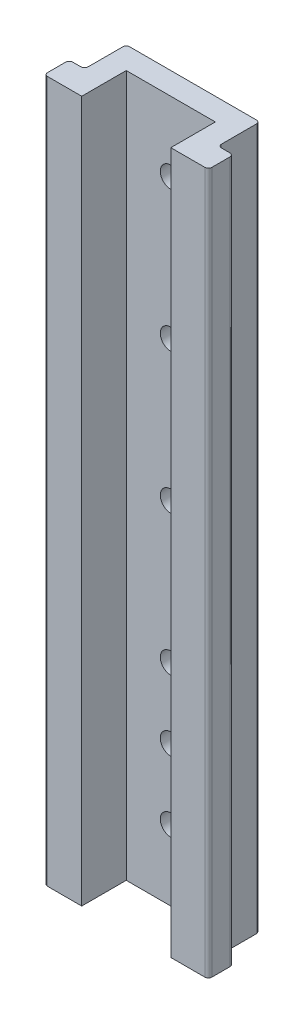
ISO-10303-21;
HEADER;
FILE_DESCRIPTION(('STEP AP214'),'2;1');
FILE_NAME('part.step','',(''),(''),'','','');
FILE_SCHEMA(('AUTOMOTIVE_DESIGN { 1 0 10303 214 1 1 1 1 }'));
ENDSEC;
DATA;
#1=APPLICATION_CONTEXT('core data for automotive mechanical design processes');
#2=APPLICATION_PROTOCOL_DEFINITION('international standard','automotive_design',2000,#1);
#3=PRODUCT_CONTEXT('',#1,'mechanical');
#4=PRODUCT('Part','Part','',(#3));
#5=PRODUCT_RELATED_PRODUCT_CATEGORY('part','',(#4));
#6=PRODUCT_DEFINITION_FORMATION('','',#4);
#7=PRODUCT_DEFINITION_CONTEXT('part definition',#1,'design');
#8=PRODUCT_DEFINITION('design','',#6,#7);
#9=PRODUCT_DEFINITION_SHAPE('','',#8);
#10=(LENGTH_UNIT() NAMED_UNIT(*) SI_UNIT(.MILLI.,.METRE.));
#11=(NAMED_UNIT(*) PLANE_ANGLE_UNIT() SI_UNIT($,.RADIAN.));
#12=(NAMED_UNIT(*) SI_UNIT($,.STERADIAN.) SOLID_ANGLE_UNIT());
#13=UNCERTAINTY_MEASURE_WITH_UNIT(LENGTH_MEASURE(1.E-05),#10,'distance_accuracy_value','');
#14=(GEOMETRIC_REPRESENTATION_CONTEXT(3) GLOBAL_UNCERTAINTY_ASSIGNED_CONTEXT((#13)) GLOBAL_UNIT_ASSIGNED_CONTEXT((#10,
#11,#12)) REPRESENTATION_CONTEXT('',''));
#15=CARTESIAN_POINT('',(0.,0.,0.));
#16=DIRECTION('',(0.,0.,1.));
#17=DIRECTION('',(1.,0.,0.));
#18=AXIS2_PLACEMENT_3D('',#15,#16,#17);
#19=CARTESIAN_POINT('',(6.35,100.,0.));
#20=DIRECTION('',(1.,0.,0.));
#21=DIRECTION('',(0.,0.,-1.));
#22=AXIS2_PLACEMENT_3D('',#19,#20,#21);
#23=PLANE('',#22);
#24=DIRECTION('',(0.,0.,1.));
#25=VECTOR('',#24,1.);
#26=CARTESIAN_POINT('',(6.35,0.,0.));
#27=LINE('',#26,#25);
#28=CARTESIAN_POINT('',(6.35,0.,-6.35000000000005));
#29=VERTEX_POINT('',#28);
#30=CARTESIAN_POINT('',(6.35,0.,0.));
#31=VERTEX_POINT('',#30);
#32=EDGE_CURVE('E212',#29,#31,#27,.T.);
#33=ORIENTED_EDGE('',*,*,#32,.T.);
#34=DIRECTION('',(0.,-1.,0.));
#35=VECTOR('',#34,1.);
#36=CARTESIAN_POINT('',(6.35,100.,0.));
#37=LINE('',#36,#35);
#38=CARTESIAN_POINT('',(6.35,100.,0.));
#39=VERTEX_POINT('',#38);
#40=EDGE_CURVE('E11',#39,#31,#37,.T.);
#41=ORIENTED_EDGE('',*,*,#40,.F.);
#42=DIRECTION('',(0.,0.,1.));
#43=VECTOR('',#42,1.);
#44=CARTESIAN_POINT('',(6.35,100.,0.));
#45=LINE('',#44,#43);
#46=CARTESIAN_POINT('',(6.35,100.,-6.35000000000005));
#47=VERTEX_POINT('',#46);
#48=EDGE_CURVE('E271',#47,#39,#45,.T.);
#49=ORIENTED_EDGE('',*,*,#48,.F.);
#50=DIRECTION('',(0.,-1.,0.));
#51=VECTOR('',#50,1.);
#52=CARTESIAN_POINT('',(6.35,100.,-6.35000000000005));
#53=LINE('',#52,#51);
#54=EDGE_CURVE('E208',#47,#29,#53,.T.);
#55=ORIENTED_EDGE('',*,*,#54,.T.);
#56=EDGE_LOOP('',(#33,#41,#49,#55));
#57=FACE_BOUND('',#56,.T.);
#58=ADVANCED_FACE('F39',(#57),#23,.F.);
#59=CARTESIAN_POINT('',(11.2078125,100.,0.));
#60=DIRECTION('',(0.,0.,-1.));
#61=DIRECTION('',(-1.,0.,0.));
#62=AXIS2_PLACEMENT_3D('',#59,#60,#61);
#63=PLANE('',#62);
#64=DIRECTION('',(1.,0.,0.));
#65=VECTOR('',#64,1.);
#66=CARTESIAN_POINT('',(11.2078125,0.,0.));
#67=LINE('',#66,#65);
#68=CARTESIAN_POINT('',(11.2078125,0.,0.));
#69=VERTEX_POINT('',#68);
#70=EDGE_CURVE('E216',#31,#69,#67,.T.);
#71=ORIENTED_EDGE('',*,*,#70,.T.);
#72=DIRECTION('',(0.,-1.,0.));
#73=VECTOR('',#72,1.);
#74=CARTESIAN_POINT('',(11.2078125,100.,0.));
#75=LINE('',#74,#73);
#76=CARTESIAN_POINT('',(11.2078125,100.,0.));
#77=VERTEX_POINT('',#76);
#78=EDGE_CURVE('E48',#77,#69,#75,.T.);
#79=ORIENTED_EDGE('',*,*,#78,.F.);
#80=DIRECTION('',(1.,0.,0.));
#81=VECTOR('',#80,1.);
#82=CARTESIAN_POINT('',(11.2078125,100.,0.));
#83=LINE('',#82,#81);
#84=EDGE_CURVE('E135',#39,#77,#83,.T.);
#85=ORIENTED_EDGE('',*,*,#84,.F.);
#86=ORIENTED_EDGE('',*,*,#40,.T.);
#87=EDGE_LOOP('',(#71,#79,#85,#86));
#88=FACE_BOUND('',#87,.T.);
#89=ADVANCED_FACE('F424',(#88),#63,.F.);
#90=CARTESIAN_POINT('',(11.2078125,100.,-0.500000000000001));
#91=DIRECTION('',(0.,-1.,0.));
#92=DIRECTION('',(0.,0.,-1.));
#93=AXIS2_PLACEMENT_3D('',#90,#91,#92);
#94=CYLINDRICAL_SURFACE('',#93,0.5);
#95=CARTESIAN_POINT('',(11.2078125,0.,-0.500000000000001));
#96=DIRECTION('',(0.,1.,0.));
#97=DIRECTION('',(0.,0.,1.));
#98=AXIS2_PLACEMENT_3D('',#95,#96,#97);
#99=CIRCLE('',#98,0.5);
#100=CARTESIAN_POINT('',(11.7078125,0.,-0.500000000000005));
#101=VERTEX_POINT('',#100);
#102=EDGE_CURVE('E220',#69,#101,#99,.T.);
#103=ORIENTED_EDGE('',*,*,#102,.T.);
#104=DIRECTION('',(0.,-1.,0.));
#105=VECTOR('',#104,1.);
#106=CARTESIAN_POINT('',(11.7078125,100.,-0.500000000000005));
#107=LINE('',#106,#105);
#108=CARTESIAN_POINT('',(11.7078125,100.,-0.500000000000005));
#109=VERTEX_POINT('',#108);
#110=EDGE_CURVE('E330',#109,#101,#107,.T.);
#111=ORIENTED_EDGE('',*,*,#110,.F.);
#112=CARTESIAN_POINT('',(11.2078125,100.,-0.500000000000001));
#113=DIRECTION('',(0.,1.,0.));
#114=DIRECTION('',(0.,0.,1.));
#115=AXIS2_PLACEMENT_3D('',#112,#113,#114);
#116=CIRCLE('',#115,0.5);
#117=EDGE_CURVE('E340',#77,#109,#116,.T.);
#118=ORIENTED_EDGE('',*,*,#117,.F.);
#119=ORIENTED_EDGE('',*,*,#78,.T.);
#120=EDGE_LOOP('',(#103,#111,#118,#119));
#121=FACE_BOUND('',#120,.T.);
#122=ADVANCED_FACE('F338',(#121),#94,.T.);
#123=CARTESIAN_POINT('',(11.7078125,100.,-3.071875));
#124=DIRECTION('',(-1.,0.,0.));
#125=DIRECTION('',(0.,0.,1.));
#126=AXIS2_PLACEMENT_3D('',#123,#124,#125);
#127=PLANE('',#126);
#128=DIRECTION('',(0.,0.,-1.));
#129=VECTOR('',#128,1.);
#130=CARTESIAN_POINT('',(11.7078125,0.,-3.071875));
#131=LINE('',#130,#129);
#132=CARTESIAN_POINT('',(11.7078125,0.,-3.071875));
#133=VERTEX_POINT('',#132);
#134=EDGE_CURVE('E223',#101,#133,#131,.T.);
#135=ORIENTED_EDGE('',*,*,#134,.T.);
#136=DIRECTION('',(0.,-1.,0.));
#137=VECTOR('',#136,1.);
#138=CARTESIAN_POINT('',(11.7078125,100.,-3.071875));
#139=LINE('',#138,#137);
#140=CARTESIAN_POINT('',(11.7078125,100.,-3.071875));
#141=VERTEX_POINT('',#140);
#142=EDGE_CURVE('E326',#141,#133,#139,.T.);
#143=ORIENTED_EDGE('',*,*,#142,.F.);
#144=DIRECTION('',(0.,0.,-1.));
#145=VECTOR('',#144,1.);
#146=CARTESIAN_POINT('',(11.7078125,100.,-3.071875));
#147=LINE('',#146,#145);
#148=EDGE_CURVE('E359',#109,#141,#147,.T.);
#149=ORIENTED_EDGE('',*,*,#148,.F.);
#150=ORIENTED_EDGE('',*,*,#110,.T.);
#151=EDGE_LOOP('',(#135,#143,#149,#150));
#152=FACE_BOUND('',#151,.T.);
#153=ADVANCED_FACE('F349',(#152),#127,.F.);
#154=CARTESIAN_POINT('',(11.2078125,100.,-3.071875));
#155=DIRECTION('',(0.,-1.,0.));
#156=DIRECTION('',(0.,0.,-1.));
#157=AXIS2_PLACEMENT_3D('',#154,#155,#156);
#158=CYLINDRICAL_SURFACE('',#157,0.5);
#159=CARTESIAN_POINT('',(11.2078125,0.,-3.071875));
#160=DIRECTION('',(0.,1.,0.));
#161=DIRECTION('',(0.,0.,-1.));
#162=AXIS2_PLACEMENT_3D('',#159,#160,#161);
#163=CIRCLE('',#162,0.5);
#164=CARTESIAN_POINT('',(11.2078125,0.,-3.571875));
#165=VERTEX_POINT('',#164);
#166=EDGE_CURVE('E226',#133,#165,#163,.T.);
#167=ORIENTED_EDGE('',*,*,#166,.T.);
#168=DIRECTION('',(0.,-1.,0.));
#169=VECTOR('',#168,1.);
#170=CARTESIAN_POINT('',(11.2078125,100.,-3.571875));
#171=LINE('',#170,#169);
#172=CARTESIAN_POINT('',(11.2078125,100.,-3.571875));
#173=VERTEX_POINT('',#172);
#174=EDGE_CURVE('E322',#173,#165,#171,.T.);
#175=ORIENTED_EDGE('',*,*,#174,.F.);
#176=CARTESIAN_POINT('',(11.2078125,100.,-3.071875));
#177=DIRECTION('',(0.,1.,0.));
#178=DIRECTION('',(0.,0.,-1.));
#179=AXIS2_PLACEMENT_3D('',#176,#177,#178);
#180=CIRCLE('',#179,0.5);
#181=EDGE_CURVE('E355',#141,#173,#180,.T.);
#182=ORIENTED_EDGE('',*,*,#181,.F.);
#183=ORIENTED_EDGE('',*,*,#142,.T.);
#184=EDGE_LOOP('',(#167,#175,#182,#183));
#185=FACE_BOUND('',#184,.T.);
#186=ADVANCED_FACE('F353',(#185),#158,.T.);
#187=CARTESIAN_POINT('',(10.025,100.,-3.57187499999999));
#188=DIRECTION('',(0.,0.,1.));
#189=DIRECTION('',(1.,0.,0.));
#190=AXIS2_PLACEMENT_3D('',#187,#188,#189);
#191=PLANE('',#190);
#192=DIRECTION('',(-1.,0.,0.));
#193=VECTOR('',#192,1.);
#194=CARTESIAN_POINT('',(10.025,0.,-3.57187499999999));
#195=LINE('',#194,#193);
#196=CARTESIAN_POINT('',(10.025,0.,-3.57187499999999));
#197=VERTEX_POINT('',#196);
#198=EDGE_CURVE('E229',#165,#197,#195,.T.);
#199=ORIENTED_EDGE('',*,*,#198,.T.);
#200=DIRECTION('',(0.,-1.,0.));
#201=VECTOR('',#200,1.);
#202=CARTESIAN_POINT('',(10.025,100.,-3.57187499999999));
#203=LINE('',#202,#201);
#204=CARTESIAN_POINT('',(10.025,100.,-3.57187499999999));
#205=VERTEX_POINT('',#204);
#206=EDGE_CURVE('E318',#205,#197,#203,.T.);
#207=ORIENTED_EDGE('',*,*,#206,.F.);
#208=DIRECTION('',(-1.,0.,0.));
#209=VECTOR('',#208,1.);
#210=CARTESIAN_POINT('',(10.025,100.,-3.57187499999999));
#211=LINE('',#210,#209);
#212=EDGE_CURVE('E358',#173,#205,#211,.T.);
#213=ORIENTED_EDGE('',*,*,#212,.F.);
#214=ORIENTED_EDGE('',*,*,#174,.T.);
#215=EDGE_LOOP('',(#199,#207,#213,#214));
#216=FACE_BOUND('',#215,.T.);
#217=ADVANCED_FACE('F437',(#216),#191,.F.);
#218=CARTESIAN_POINT('',(10.025,100.,-4.07187499999999));
#219=DIRECTION('',(0.,-1.,0.));
#220=DIRECTION('',(0.,0.,-1.));
#221=AXIS2_PLACEMENT_3D('',#218,#219,#220);
#222=CYLINDRICAL_SURFACE('',#221,0.499999999999999);
#223=CARTESIAN_POINT('',(10.025,0.,-4.07187499999999));
#224=DIRECTION('',(0.,-1.,0.));
#225=DIRECTION('',(0.,0.,1.));
#226=AXIS2_PLACEMENT_3D('',#223,#224,#225);
#227=CIRCLE('',#226,0.499999999999999);
#228=CARTESIAN_POINT('',(9.52500000000001,0.,-4.071875));
#229=VERTEX_POINT('',#228);
#230=EDGE_CURVE('E232',#197,#229,#227,.T.);
#231=ORIENTED_EDGE('',*,*,#230,.T.);
#232=DIRECTION('',(0.,-1.,0.));
#233=VECTOR('',#232,1.);
#234=CARTESIAN_POINT('',(9.52500000000001,100.,-4.071875));
#235=LINE('',#234,#233);
#236=CARTESIAN_POINT('',(9.52500000000001,100.,-4.071875));
#237=VERTEX_POINT('',#236);
#238=EDGE_CURVE('E314',#237,#229,#235,.T.);
#239=ORIENTED_EDGE('',*,*,#238,.F.);
#240=CARTESIAN_POINT('',(10.025,100.,-4.07187499999999));
#241=DIRECTION('',(0.,-1.,0.));
#242=DIRECTION('',(0.,0.,1.));
#243=AXIS2_PLACEMENT_3D('',#240,#241,#242);
#244=CIRCLE('',#243,0.499999999999999);
#245=EDGE_CURVE('E363',#205,#237,#244,.T.);
#246=ORIENTED_EDGE('',*,*,#245,.F.);
#247=ORIENTED_EDGE('',*,*,#206,.T.);
#248=EDGE_LOOP('',(#231,#239,#246,#247));
#249=FACE_BOUND('',#248,.T.);
#250=ADVANCED_FACE('F440',(#249),#222,.F.);
#251=CARTESIAN_POINT('',(9.525,100.,-9.02499999999999));
#252=DIRECTION('',(-1.,0.,0.));
#253=DIRECTION('',(0.,0.,1.));
#254=AXIS2_PLACEMENT_3D('',#251,#252,#253);
#255=PLANE('',#254);
#256=DIRECTION('',(0.,0.,-1.));
#257=VECTOR('',#256,1.);
#258=CARTESIAN_POINT('',(9.525,0.,-9.02499999999999));
#259=LINE('',#258,#257);
#260=CARTESIAN_POINT('',(9.525,0.,-9.02499999999999));
#261=VERTEX_POINT('',#260);
#262=EDGE_CURVE('E235',#229,#261,#259,.T.);
#263=ORIENTED_EDGE('',*,*,#262,.T.);
#264=DIRECTION('',(0.,-1.,0.));
#265=VECTOR('',#264,1.);
#266=CARTESIAN_POINT('',(9.525,100.,-9.02499999999999));
#267=LINE('',#266,#265);
#268=CARTESIAN_POINT('',(9.525,100.,-9.02499999999999));
#269=VERTEX_POINT('',#268);
#270=EDGE_CURVE('E310',#269,#261,#267,.T.);
#271=ORIENTED_EDGE('',*,*,#270,.F.);
#272=DIRECTION('',(0.,0.,-1.));
#273=VECTOR('',#272,1.);
#274=CARTESIAN_POINT('',(9.525,100.,-9.02499999999999));
#275=LINE('',#274,#273);
#276=EDGE_CURVE('E370',#237,#269,#275,.T.);
#277=ORIENTED_EDGE('',*,*,#276,.F.);
#278=ORIENTED_EDGE('',*,*,#238,.T.);
#279=EDGE_LOOP('',(#263,#271,#277,#278));
#280=FACE_BOUND('',#279,.T.);
#281=ADVANCED_FACE('F444',(#280),#255,.F.);
#282=CARTESIAN_POINT('',(9.025,100.,-9.02499999999999));
#283=DIRECTION('',(0.,-1.,0.));
#284=DIRECTION('',(0.,0.,-1.));
#285=AXIS2_PLACEMENT_3D('',#282,#283,#284);
#286=CYLINDRICAL_SURFACE('',#285,0.5);
#287=CARTESIAN_POINT('',(9.025,0.,-9.02499999999999));
#288=DIRECTION('',(0.,1.,0.));
#289=DIRECTION('',(0.,0.,-1.));
#290=AXIS2_PLACEMENT_3D('',#287,#288,#289);
#291=CIRCLE('',#290,0.5);
#292=CARTESIAN_POINT('',(9.025,0.,-9.52499999999999));
#293=VERTEX_POINT('',#292);
#294=EDGE_CURVE('E238',#261,#293,#291,.T.);
#295=ORIENTED_EDGE('',*,*,#294,.T.);
#296=DIRECTION('',(0.,-1.,0.));
#297=VECTOR('',#296,1.);
#298=CARTESIAN_POINT('',(9.025,100.,-9.52499999999999));
#299=LINE('',#298,#297);
#300=CARTESIAN_POINT('',(9.025,100.,-9.52499999999999));
#301=VERTEX_POINT('',#300);
#302=EDGE_CURVE('E306',#301,#293,#299,.T.);
#303=ORIENTED_EDGE('',*,*,#302,.F.);
#304=CARTESIAN_POINT('',(9.025,100.,-9.02499999999999));
#305=DIRECTION('',(0.,1.,0.));
#306=DIRECTION('',(0.,0.,-1.));
#307=AXIS2_PLACEMENT_3D('',#304,#305,#306);
#308=CIRCLE('',#307,0.5);
#309=EDGE_CURVE('E373',#269,#301,#308,.T.);
#310=ORIENTED_EDGE('',*,*,#309,.F.);
#311=ORIENTED_EDGE('',*,*,#270,.T.);
#312=EDGE_LOOP('',(#295,#303,#310,#311));
#313=FACE_BOUND('',#312,.T.);
#314=ADVANCED_FACE('F448',(#313),#286,.T.);
#315=CARTESIAN_POINT('',(-9.025,100.,-9.52500000000005));
#316=DIRECTION('',(0.,0.,1.));
#317=DIRECTION('',(1.,0.,0.));
#318=AXIS2_PLACEMENT_3D('',#315,#316,#317);
#319=PLANE('',#318);
#320=CARTESIAN_POINT('',(0.,10.,-9.52500000000002));
#321=DIRECTION('',(0.,0.,-1.));
#322=DIRECTION('',(-1.,0.,0.));
#323=AXIS2_PLACEMENT_3D('',#320,#321,#322);
#324=CIRCLE('',#323,1.5);
#325=CARTESIAN_POINT('',(-1.49999999999997,10.,-9.52500000000003));
#326=VERTEX_POINT('',#325);
#327=EDGE_CURVE('E582',#326,#326,#324,.T.);
#328=ORIENTED_EDGE('',*,*,#327,.F.);
#329=EDGE_LOOP('',(#328));
#330=FACE_BOUND('',#329,.T.);
#331=CARTESIAN_POINT('',(0.,20.,-9.52500000000002));
#332=DIRECTION('',(0.,0.,-1.));
#333=DIRECTION('',(-1.,0.,0.));
#334=AXIS2_PLACEMENT_3D('',#331,#332,#333);
#335=CIRCLE('',#334,1.5);
#336=CARTESIAN_POINT('',(-1.49999999999993,20.,-9.52500000000003));
#337=VERTEX_POINT('',#336);
#338=EDGE_CURVE('E590',#337,#337,#335,.T.);
#339=ORIENTED_EDGE('',*,*,#338,.F.);
#340=EDGE_LOOP('',(#339));
#341=FACE_BOUND('',#340,.T.);
#342=CARTESIAN_POINT('',(0.,30.,-9.52500000000002));
#343=DIRECTION('',(0.,0.,-1.));
#344=DIRECTION('',(-1.,0.,0.));
#345=AXIS2_PLACEMENT_3D('',#342,#343,#344);
#346=CIRCLE('',#345,1.5);
#347=CARTESIAN_POINT('',(-1.4999999999999,30.,-9.52500000000003));
#348=VERTEX_POINT('',#347);
#349=EDGE_CURVE('E598',#348,#348,#346,.T.);
#350=ORIENTED_EDGE('',*,*,#349,.F.);
#351=EDGE_LOOP('',(#350));
#352=FACE_BOUND('',#351,.T.);
#353=CARTESIAN_POINT('',(1.67418655611187E-13,50.,-9.52500000000002));
#354=DIRECTION('',(0.,0.,-1.));
#355=DIRECTION('',(-1.,0.,0.));
#356=AXIS2_PLACEMENT_3D('',#353,#354,#355);
#357=CIRCLE('',#356,1.5);
#358=CARTESIAN_POINT('',(-1.49999999999983,50.,-9.52500000000003));
#359=VERTEX_POINT('',#358);
#360=EDGE_CURVE('E606',#359,#359,#357,.T.);
#361=ORIENTED_EDGE('',*,*,#360,.F.);
#362=EDGE_LOOP('',(#361));
#363=FACE_BOUND('',#362,.T.);
#364=CARTESIAN_POINT('',(2.36023635588903E-13,70.,-9.52500000000002));
#365=DIRECTION('',(0.,0.,-1.));
#366=DIRECTION('',(-1.,0.,0.));
#367=AXIS2_PLACEMENT_3D('',#364,#365,#366);
#368=CIRCLE('',#367,1.5);
#369=CARTESIAN_POINT('',(-1.49999999999976,70.,-9.52500000000003));
#370=VERTEX_POINT('',#369);
#371=EDGE_CURVE('E614',#370,#370,#368,.T.);
#372=ORIENTED_EDGE('',*,*,#371,.F.);
#373=EDGE_LOOP('',(#372));
#374=FACE_BOUND('',#373,.T.);
#375=CARTESIAN_POINT('',(3.04628615566618E-13,90.,-9.52500000000002));
#376=DIRECTION('',(0.,0.,-1.));
#377=DIRECTION('',(-1.,0.,0.));
#378=AXIS2_PLACEMENT_3D('',#375,#376,#377);
#379=CIRCLE('',#378,1.5);
#380=CARTESIAN_POINT('',(-1.4999999999997,90.,-9.52500000000003));
#381=VERTEX_POINT('',#380);
#382=EDGE_CURVE('E622',#381,#381,#379,.T.);
#383=ORIENTED_EDGE('',*,*,#382,.F.);
#384=EDGE_LOOP('',(#383));
#385=FACE_BOUND('',#384,.T.);
#386=DIRECTION('',(-1.,0.,0.));
#387=VECTOR('',#386,1.);
#388=CARTESIAN_POINT('',(-9.025,0.,-9.52500000000005));
#389=LINE('',#388,#387);
#390=CARTESIAN_POINT('',(-9.025,0.,-9.52500000000005));
#391=VERTEX_POINT('',#390);
#392=EDGE_CURVE('E241',#293,#391,#389,.T.);
#393=ORIENTED_EDGE('',*,*,#392,.T.);
#394=DIRECTION('',(0.,-1.,0.));
#395=VECTOR('',#394,1.);
#396=CARTESIAN_POINT('',(-9.025,100.,-9.52500000000005));
#397=LINE('',#396,#395);
#398=CARTESIAN_POINT('',(-9.025,100.,-9.52500000000005));
#399=VERTEX_POINT('',#398);
#400=EDGE_CURVE('E302',#399,#391,#397,.T.);
#401=ORIENTED_EDGE('',*,*,#400,.F.);
#402=DIRECTION('',(-1.,0.,0.));
#403=VECTOR('',#402,1.);
#404=CARTESIAN_POINT('',(-9.025,100.,-9.52500000000005));
#405=LINE('',#404,#403);
#406=EDGE_CURVE('E376',#301,#399,#405,.T.);
#407=ORIENTED_EDGE('',*,*,#406,.F.);
#408=ORIENTED_EDGE('',*,*,#302,.T.);
#409=EDGE_LOOP('',(#393,#401,#407,#408));
#410=FACE_BOUND('',#409,.T.);
#411=ADVANCED_FACE('F452',(#330,#341,#352,#363,#374,#385,#410),#319,.F.);
#412=CARTESIAN_POINT('',(-9.025,100.,-9.02500000000005));
#413=DIRECTION('',(0.,-1.,0.));
#414=DIRECTION('',(0.,0.,-1.));
#415=AXIS2_PLACEMENT_3D('',#412,#413,#414);
#416=CYLINDRICAL_SURFACE('',#415,0.5);
#417=CARTESIAN_POINT('',(-9.025,0.,-9.02500000000005));
#418=DIRECTION('',(0.,1.,0.));
#419=DIRECTION('',(0.,0.,-1.));
#420=AXIS2_PLACEMENT_3D('',#417,#418,#419);
#421=CIRCLE('',#420,0.5);
#422=CARTESIAN_POINT('',(-9.525,0.,-9.02500000000005));
#423=VERTEX_POINT('',#422);
#424=EDGE_CURVE('E244',#391,#423,#421,.T.);
#425=ORIENTED_EDGE('',*,*,#424,.T.);
#426=DIRECTION('',(0.,-1.,0.));
#427=VECTOR('',#426,1.);
#428=CARTESIAN_POINT('',(-9.525,100.,-9.02500000000005));
#429=LINE('',#428,#427);
#430=CARTESIAN_POINT('',(-9.525,100.,-9.02500000000005));
#431=VERTEX_POINT('',#430);
#432=EDGE_CURVE('E298',#431,#423,#429,.T.);
#433=ORIENTED_EDGE('',*,*,#432,.F.);
#434=CARTESIAN_POINT('',(-9.025,100.,-9.02500000000005));
#435=DIRECTION('',(0.,1.,0.));
#436=DIRECTION('',(0.,0.,-1.));
#437=AXIS2_PLACEMENT_3D('',#434,#435,#436);
#438=CIRCLE('',#437,0.5);
#439=EDGE_CURVE('E379',#399,#431,#438,.T.);
#440=ORIENTED_EDGE('',*,*,#439,.F.);
#441=ORIENTED_EDGE('',*,*,#400,.T.);
#442=EDGE_LOOP('',(#425,#433,#440,#441));
#443=FACE_BOUND('',#442,.T.);
#444=ADVANCED_FACE('F456',(#443),#416,.T.);
#445=CARTESIAN_POINT('',(-9.525,100.,-9.02500000000005));
#446=DIRECTION('',(1.,0.,0.));
#447=DIRECTION('',(0.,0.,-1.));
#448=AXIS2_PLACEMENT_3D('',#445,#446,#447);
#449=PLANE('',#448);
#450=DIRECTION('',(0.,0.,1.));
#451=VECTOR('',#450,1.);
#452=CARTESIAN_POINT('',(-9.525,0.,-9.02500000000005));
#453=LINE('',#452,#451);
#454=CARTESIAN_POINT('',(-9.52500000000001,0.,-4.071875));
#455=VERTEX_POINT('',#454);
#456=EDGE_CURVE('E247',#423,#455,#453,.T.);
#457=ORIENTED_EDGE('',*,*,#456,.T.);
#458=DIRECTION('',(0.,-1.,0.));
#459=VECTOR('',#458,1.);
#460=CARTESIAN_POINT('',(-9.52500000000001,100.,-4.071875));
#461=LINE('',#460,#459);
#462=CARTESIAN_POINT('',(-9.52500000000001,100.,-4.071875));
#463=VERTEX_POINT('',#462);
#464=EDGE_CURVE('E294',#463,#455,#461,.T.);
#465=ORIENTED_EDGE('',*,*,#464,.F.);
#466=DIRECTION('',(0.,0.,1.));
#467=VECTOR('',#466,1.);
#468=CARTESIAN_POINT('',(-9.525,100.,-9.02500000000005));
#469=LINE('',#468,#467);
#470=EDGE_CURVE('E382',#431,#463,#469,.T.);
#471=ORIENTED_EDGE('',*,*,#470,.F.);
#472=ORIENTED_EDGE('',*,*,#432,.T.);
#473=EDGE_LOOP('',(#457,#465,#471,#472));
#474=FACE_BOUND('',#473,.T.);
#475=ADVANCED_FACE('F460',(#474),#449,.F.);
#476=CARTESIAN_POINT('',(-10.025,100.,-4.07187499999999));
#477=DIRECTION('',(0.,-1.,0.));
#478=DIRECTION('',(0.,0.,-1.));
#479=AXIS2_PLACEMENT_3D('',#476,#477,#478);
#480=CYLINDRICAL_SURFACE('',#479,0.499999999999999);
#481=CARTESIAN_POINT('',(-10.025,0.,-4.07187499999999));
#482=DIRECTION('',(0.,-1.,0.));
#483=DIRECTION('',(0.,0.,1.));
#484=AXIS2_PLACEMENT_3D('',#481,#482,#483);
#485=CIRCLE('',#484,0.499999999999999);
#486=CARTESIAN_POINT('',(-10.025,0.,-3.57187499999999));
#487=VERTEX_POINT('',#486);
#488=EDGE_CURVE('E250',#455,#487,#485,.T.);
#489=ORIENTED_EDGE('',*,*,#488,.T.);
#490=DIRECTION('',(0.,-1.,0.));
#491=VECTOR('',#490,1.);
#492=CARTESIAN_POINT('',(-10.025,100.,-3.57187499999999));
#493=LINE('',#492,#491);
#494=CARTESIAN_POINT('',(-10.025,100.,-3.57187499999999));
#495=VERTEX_POINT('',#494);
#496=EDGE_CURVE('E290',#495,#487,#493,.T.);
#497=ORIENTED_EDGE('',*,*,#496,.F.);
#498=CARTESIAN_POINT('',(-10.025,100.,-4.07187499999999));
#499=DIRECTION('',(0.,-1.,0.));
#500=DIRECTION('',(0.,0.,1.));
#501=AXIS2_PLACEMENT_3D('',#498,#499,#500);
#502=CIRCLE('',#501,0.499999999999999);
#503=EDGE_CURVE('E385',#463,#495,#502,.T.);
#504=ORIENTED_EDGE('',*,*,#503,.F.);
#505=ORIENTED_EDGE('',*,*,#464,.T.);
#506=EDGE_LOOP('',(#489,#497,#504,#505));
#507=FACE_BOUND('',#506,.T.);
#508=ADVANCED_FACE('F464',(#507),#480,.F.);
#509=CARTESIAN_POINT('',(-10.025,100.,-3.57187499999999));
#510=DIRECTION('',(0.,0.,1.));
#511=DIRECTION('',(1.,0.,0.));
#512=AXIS2_PLACEMENT_3D('',#509,#510,#511);
#513=PLANE('',#512);
#514=DIRECTION('',(-1.,0.,0.));
#515=VECTOR('',#514,1.);
#516=CARTESIAN_POINT('',(-10.025,0.,-3.57187499999999));
#517=LINE('',#516,#515);
#518=CARTESIAN_POINT('',(-11.2078125,0.,-3.571875));
#519=VERTEX_POINT('',#518);
#520=EDGE_CURVE('E253',#487,#519,#517,.T.);
#521=ORIENTED_EDGE('',*,*,#520,.T.);
#522=DIRECTION('',(0.,-1.,0.));
#523=VECTOR('',#522,1.);
#524=CARTESIAN_POINT('',(-11.2078125,100.,-3.571875));
#525=LINE('',#524,#523);
#526=CARTESIAN_POINT('',(-11.2078125,100.,-3.571875));
#527=VERTEX_POINT('',#526);
#528=EDGE_CURVE('E286',#527,#519,#525,.T.);
#529=ORIENTED_EDGE('',*,*,#528,.F.);
#530=DIRECTION('',(-1.,0.,0.));
#531=VECTOR('',#530,1.);
#532=CARTESIAN_POINT('',(-10.025,100.,-3.57187499999999));
#533=LINE('',#532,#531);
#534=EDGE_CURVE('E388',#495,#527,#533,.T.);
#535=ORIENTED_EDGE('',*,*,#534,.F.);
#536=ORIENTED_EDGE('',*,*,#496,.T.);
#537=EDGE_LOOP('',(#521,#529,#535,#536));
#538=FACE_BOUND('',#537,.T.);
#539=ADVANCED_FACE('F468',(#538),#513,.F.);
#540=CARTESIAN_POINT('',(-11.2078125,100.,-3.071875));
#541=DIRECTION('',(0.,-1.,0.));
#542=DIRECTION('',(0.,0.,-1.));
#543=AXIS2_PLACEMENT_3D('',#540,#541,#542);
#544=CYLINDRICAL_SURFACE('',#543,0.5);
#545=CARTESIAN_POINT('',(-11.2078125,0.,-3.071875));
#546=DIRECTION('',(0.,1.,0.));
#547=DIRECTION('',(0.,0.,-1.));
#548=AXIS2_PLACEMENT_3D('',#545,#546,#547);
#549=CIRCLE('',#548,0.5);
#550=CARTESIAN_POINT('',(-11.7078125,0.,-3.071875));
#551=VERTEX_POINT('',#550);
#552=EDGE_CURVE('E256',#519,#551,#549,.T.);
#553=ORIENTED_EDGE('',*,*,#552,.T.);
#554=DIRECTION('',(0.,-1.,0.));
#555=VECTOR('',#554,1.);
#556=CARTESIAN_POINT('',(-11.7078125,100.,-3.071875));
#557=LINE('',#556,#555);
#558=CARTESIAN_POINT('',(-11.7078125,100.,-3.071875));
#559=VERTEX_POINT('',#558);
#560=EDGE_CURVE('E282',#559,#551,#557,.T.);
#561=ORIENTED_EDGE('',*,*,#560,.F.);
#562=CARTESIAN_POINT('',(-11.2078125,100.,-3.071875));
#563=DIRECTION('',(0.,1.,0.));
#564=DIRECTION('',(0.,0.,-1.));
#565=AXIS2_PLACEMENT_3D('',#562,#563,#564);
#566=CIRCLE('',#565,0.5);
#567=EDGE_CURVE('E391',#527,#559,#566,.T.);
#568=ORIENTED_EDGE('',*,*,#567,.F.);
#569=ORIENTED_EDGE('',*,*,#528,.T.);
#570=EDGE_LOOP('',(#553,#561,#568,#569));
#571=FACE_BOUND('',#570,.T.);
#572=ADVANCED_FACE('F472',(#571),#544,.T.);
#573=CARTESIAN_POINT('',(-11.7078125,100.,-3.071875));
#574=DIRECTION('',(1.,0.,0.));
#575=DIRECTION('',(0.,0.,-1.));
#576=AXIS2_PLACEMENT_3D('',#573,#574,#575);
#577=PLANE('',#576);
#578=DIRECTION('',(0.,0.,1.));
#579=VECTOR('',#578,1.);
#580=CARTESIAN_POINT('',(-11.7078125,0.,-3.071875));
#581=LINE('',#580,#579);
#582=CARTESIAN_POINT('',(-11.7078125,0.,-0.500000000000006));
#583=VERTEX_POINT('',#582);
#584=EDGE_CURVE('E259',#551,#583,#581,.T.);
#585=ORIENTED_EDGE('',*,*,#584,.T.);
#586=DIRECTION('',(0.,-1.,0.));
#587=VECTOR('',#586,1.);
#588=CARTESIAN_POINT('',(-11.7078125,100.,-0.500000000000006));
#589=LINE('',#588,#587);
#590=CARTESIAN_POINT('',(-11.7078125,100.,-0.500000000000006));
#591=VERTEX_POINT('',#590);
#592=EDGE_CURVE('E278',#591,#583,#589,.T.);
#593=ORIENTED_EDGE('',*,*,#592,.F.);
#594=DIRECTION('',(0.,0.,1.));
#595=VECTOR('',#594,1.);
#596=CARTESIAN_POINT('',(-11.7078125,100.,-3.071875));
#597=LINE('',#596,#595);
#598=EDGE_CURVE('E394',#559,#591,#597,.T.);
#599=ORIENTED_EDGE('',*,*,#598,.F.);
#600=ORIENTED_EDGE('',*,*,#560,.T.);
#601=EDGE_LOOP('',(#585,#593,#599,#600));
#602=FACE_BOUND('',#601,.T.);
#603=ADVANCED_FACE('F402',(#602),#577,.F.);
#604=CARTESIAN_POINT('',(-11.2078125,100.,-0.500000000000003));
#605=DIRECTION('',(0.,-1.,0.));
#606=DIRECTION('',(0.,0.,-1.));
#607=AXIS2_PLACEMENT_3D('',#604,#605,#606);
#608=CYLINDRICAL_SURFACE('',#607,0.5);
#609=CARTESIAN_POINT('',(-11.2078125,0.,-0.500000000000003));
#610=DIRECTION('',(0.,1.,0.));
#611=DIRECTION('',(0.,0.,1.));
#612=AXIS2_PLACEMENT_3D('',#609,#610,#611);
#613=CIRCLE('',#612,0.5);
#614=CARTESIAN_POINT('',(-11.2078125,0.,0.));
#615=VERTEX_POINT('',#614);
#616=EDGE_CURVE('E262',#583,#615,#613,.T.);
#617=ORIENTED_EDGE('',*,*,#616,.T.);
#618=DIRECTION('',(0.,-1.,0.));
#619=VECTOR('',#618,1.);
#620=CARTESIAN_POINT('',(-11.2078125,100.,0.));
#621=LINE('',#620,#619);
#622=CARTESIAN_POINT('',(-11.2078125,100.,0.));
#623=VERTEX_POINT('',#622);
#624=EDGE_CURVE('E201',#623,#615,#621,.T.);
#625=ORIENTED_EDGE('',*,*,#624,.F.);
#626=CARTESIAN_POINT('',(-11.2078125,100.,-0.500000000000003));
#627=DIRECTION('',(0.,1.,0.));
#628=DIRECTION('',(0.,0.,1.));
#629=AXIS2_PLACEMENT_3D('',#626,#627,#628);
#630=CIRCLE('',#629,0.5);
#631=EDGE_CURVE('E190',#591,#623,#630,.T.);
#632=ORIENTED_EDGE('',*,*,#631,.F.);
#633=ORIENTED_EDGE('',*,*,#592,.T.);
#634=EDGE_LOOP('',(#617,#625,#632,#633));
#635=FACE_BOUND('',#634,.T.);
#636=ADVANCED_FACE('F406',(#635),#608,.T.);
#637=CARTESIAN_POINT('',(-11.2078125,100.,0.));
#638=DIRECTION('',(0.,0.,-1.));
#639=DIRECTION('',(-1.,0.,0.));
#640=AXIS2_PLACEMENT_3D('',#637,#638,#639);
#641=PLANE('',#640);
#642=DIRECTION('',(1.,0.,0.));
#643=VECTOR('',#642,1.);
#644=CARTESIAN_POINT('',(-11.2078125,0.,0.));
#645=LINE('',#644,#643);
#646=CARTESIAN_POINT('',(-6.35,0.,0.));
#647=VERTEX_POINT('',#646);
#648=EDGE_CURVE('E199',#615,#647,#645,.T.);
#649=ORIENTED_EDGE('',*,*,#648,.T.);
#650=DIRECTION('',(0.,-1.,0.));
#651=VECTOR('',#650,1.);
#652=CARTESIAN_POINT('',(-6.35,100.,0.));
#653=LINE('',#652,#651);
#654=CARTESIAN_POINT('',(-6.35,100.,0.));
#655=VERTEX_POINT('',#654);
#656=EDGE_CURVE('E196',#655,#647,#653,.T.);
#657=ORIENTED_EDGE('',*,*,#656,.F.);
#658=DIRECTION('',(1.,0.,0.));
#659=VECTOR('',#658,1.);
#660=CARTESIAN_POINT('',(-11.2078125,100.,0.));
#661=LINE('',#660,#659);
#662=EDGE_CURVE('E184',#623,#655,#661,.T.);
#663=ORIENTED_EDGE('',*,*,#662,.F.);
#664=ORIENTED_EDGE('',*,*,#624,.T.);
#665=EDGE_LOOP('',(#649,#657,#663,#664));
#666=FACE_BOUND('',#665,.T.);
#667=ADVANCED_FACE('F197',(#666),#641,.F.);
#668=CARTESIAN_POINT('',(-6.35,100.,0.));
#669=DIRECTION('',(-1.,0.,0.));
#670=DIRECTION('',(0.,0.,1.));
#671=AXIS2_PLACEMENT_3D('',#668,#669,#670);
#672=PLANE('',#671);
#673=DIRECTION('',(0.,0.,-1.));
#674=VECTOR('',#673,1.);
#675=CARTESIAN_POINT('',(-6.35,0.,0.));
#676=LINE('',#675,#674);
#677=CARTESIAN_POINT('',(-6.35,0.,-6.35000000000005));
#678=VERTEX_POINT('',#677);
#679=EDGE_CURVE('E121',#647,#678,#676,.T.);
#680=ORIENTED_EDGE('',*,*,#679,.T.);
#681=DIRECTION('',(0.,-1.,0.));
#682=VECTOR('',#681,1.);
#683=CARTESIAN_POINT('',(-6.35,100.,-6.35000000000005));
#684=LINE('',#683,#682);
#685=CARTESIAN_POINT('',(-6.35,100.,-6.35000000000005));
#686=VERTEX_POINT('',#685);
#687=EDGE_CURVE('E202',#686,#678,#684,.T.);
#688=ORIENTED_EDGE('',*,*,#687,.F.);
#689=DIRECTION('',(0.,0.,-1.));
#690=VECTOR('',#689,1.);
#691=CARTESIAN_POINT('',(-6.35,100.,0.));
#692=LINE('',#691,#690);
#693=EDGE_CURVE('E188',#655,#686,#692,.T.);
#694=ORIENTED_EDGE('',*,*,#693,.F.);
#695=ORIENTED_EDGE('',*,*,#656,.T.);
#696=EDGE_LOOP('',(#680,#688,#694,#695));
#697=FACE_BOUND('',#696,.T.);
#698=ADVANCED_FACE('F204',(#697),#672,.F.);
#699=CARTESIAN_POINT('',(6.35,100.,-6.35000000000005));
#700=DIRECTION('',(0.,0.,-1.));
#701=DIRECTION('',(-1.,0.,0.));
#702=AXIS2_PLACEMENT_3D('',#699,#700,#701);
#703=PLANE('',#702);
#704=CARTESIAN_POINT('',(0.,10.,-6.35000000000005));
#705=DIRECTION('',(0.,0.,-1.));
#706=DIRECTION('',(-1.,0.,0.));
#707=AXIS2_PLACEMENT_3D('',#704,#705,#706);
#708=CIRCLE('',#707,1.5);
#709=CARTESIAN_POINT('',(-1.49999999999998,10.,-6.35000000000005));
#710=VERTEX_POINT('',#709);
#711=EDGE_CURVE('E217',#710,#710,#708,.F.);
#712=ORIENTED_EDGE('',*,*,#711,.F.);
#713=EDGE_LOOP('',(#712));
#714=FACE_BOUND('',#713,.T.);
#715=CARTESIAN_POINT('',(0.,20.,-6.35000000000005));
#716=DIRECTION('',(0.,0.,-1.));
#717=DIRECTION('',(-1.,0.,0.));
#718=AXIS2_PLACEMENT_3D('',#715,#716,#717);
#719=CIRCLE('',#718,1.5);
#720=CARTESIAN_POINT('',(-1.49999999999995,20.,-6.35000000000005));
#721=VERTEX_POINT('',#720);
#722=EDGE_CURVE('E587',#721,#721,#719,.F.);
#723=ORIENTED_EDGE('',*,*,#722,.F.);
#724=EDGE_LOOP('',(#723));
#725=FACE_BOUND('',#724,.T.);
#726=CARTESIAN_POINT('',(0.,30.,-6.35000000000005));
#727=DIRECTION('',(0.,0.,-1.));
#728=DIRECTION('',(-1.,0.,0.));
#729=AXIS2_PLACEMENT_3D('',#726,#727,#728);
#730=CIRCLE('',#729,1.5);
#731=CARTESIAN_POINT('',(-1.49999999999991,30.,-6.35000000000005));
#732=VERTEX_POINT('',#731);
#733=EDGE_CURVE('E594',#732,#732,#730,.F.);
#734=ORIENTED_EDGE('',*,*,#733,.F.);
#735=EDGE_LOOP('',(#734));
#736=FACE_BOUND('',#735,.T.);
#737=CARTESIAN_POINT('',(1.57349090392602E-13,50.,-6.35000000000005));
#738=DIRECTION('',(0.,0.,-1.));
#739=DIRECTION('',(-1.,0.,0.));
#740=AXIS2_PLACEMENT_3D('',#737,#738,#739);
#741=CIRCLE('',#740,1.5);
#742=CARTESIAN_POINT('',(-1.49999999999984,50.,-6.35000000000005));
#743=VERTEX_POINT('',#742);
#744=EDGE_CURVE('E602',#743,#743,#741,.F.);
#745=ORIENTED_EDGE('',*,*,#744,.F.);
#746=EDGE_LOOP('',(#745));
#747=FACE_BOUND('',#746,.T.);
#748=CARTESIAN_POINT('',(2.25954070370317E-13,70.,-6.35000000000005));
#749=DIRECTION('',(0.,0.,-1.));
#750=DIRECTION('',(-1.,0.,0.));
#751=AXIS2_PLACEMENT_3D('',#748,#749,#750);
#752=CIRCLE('',#751,1.5);
#753=CARTESIAN_POINT('',(-1.49999999999977,70.,-6.35000000000005));
#754=VERTEX_POINT('',#753);
#755=EDGE_CURVE('E610',#754,#754,#752,.F.);
#756=ORIENTED_EDGE('',*,*,#755,.F.);
#757=EDGE_LOOP('',(#756));
#758=FACE_BOUND('',#757,.T.);
#759=CARTESIAN_POINT('',(2.94559050348033E-13,90.,-6.35000000000005));
#760=DIRECTION('',(0.,0.,-1.));
#761=DIRECTION('',(-1.,0.,0.));
#762=AXIS2_PLACEMENT_3D('',#759,#760,#761);
#763=CIRCLE('',#762,1.5);
#764=CARTESIAN_POINT('',(-1.49999999999971,90.,-6.35000000000005));
#765=VERTEX_POINT('',#764);
#766=EDGE_CURVE('E618',#765,#765,#763,.F.);
#767=ORIENTED_EDGE('',*,*,#766,.F.);
#768=EDGE_LOOP('',(#767));
#769=FACE_BOUND('',#768,.T.);
#770=DIRECTION('',(1.,0.,0.));
#771=VECTOR('',#770,1.);
#772=CARTESIAN_POINT('',(6.35,0.,-6.35000000000005));
#773=LINE('',#772,#771);
#774=EDGE_CURVE('E127',#678,#29,#773,.T.);
#775=ORIENTED_EDGE('',*,*,#774,.T.);
#776=ORIENTED_EDGE('',*,*,#54,.F.);
#777=DIRECTION('',(1.,0.,0.));
#778=VECTOR('',#777,1.);
#779=CARTESIAN_POINT('',(6.35,100.,-6.35000000000005));
#780=LINE('',#779,#778);
#781=EDGE_CURVE('E56',#686,#47,#780,.T.);
#782=ORIENTED_EDGE('',*,*,#781,.F.);
#783=ORIENTED_EDGE('',*,*,#687,.T.);
#784=EDGE_LOOP('',(#775,#776,#782,#783));
#785=FACE_BOUND('',#784,.T.);
#786=ADVANCED_FACE('F410',(#714,#725,#736,#747,#758,#769,#785),#703,.F.);
#787=CARTESIAN_POINT('',(-11.2078125,100.,-0.500000000000003));
#788=DIRECTION('',(0.,1.,0.));
#789=DIRECTION('',(0.,0.,1.));
#790=AXIS2_PLACEMENT_3D('',#787,#788,#789);
#791=PLANE('',#790);
#792=ORIENTED_EDGE('',*,*,#48,.T.);
#793=ORIENTED_EDGE('',*,*,#84,.T.);
#794=ORIENTED_EDGE('',*,*,#117,.T.);
#795=ORIENTED_EDGE('',*,*,#148,.T.);
#796=ORIENTED_EDGE('',*,*,#181,.T.);
#797=ORIENTED_EDGE('',*,*,#212,.T.);
#798=ORIENTED_EDGE('',*,*,#245,.T.);
#799=ORIENTED_EDGE('',*,*,#276,.T.);
#800=ORIENTED_EDGE('',*,*,#309,.T.);
#801=ORIENTED_EDGE('',*,*,#406,.T.);
#802=ORIENTED_EDGE('',*,*,#439,.T.);
#803=ORIENTED_EDGE('',*,*,#470,.T.);
#804=ORIENTED_EDGE('',*,*,#503,.T.);
#805=ORIENTED_EDGE('',*,*,#534,.T.);
#806=ORIENTED_EDGE('',*,*,#567,.T.);
#807=ORIENTED_EDGE('',*,*,#598,.T.);
#808=ORIENTED_EDGE('',*,*,#631,.T.);
#809=ORIENTED_EDGE('',*,*,#662,.T.);
#810=ORIENTED_EDGE('',*,*,#693,.T.);
#811=ORIENTED_EDGE('',*,*,#781,.T.);
#812=EDGE_LOOP('',(#792,#793,#794,#795,#796,#797,#798,#799,#800,#801,#802,#803,#804,#805,#806,
#807,#808,#809,#810,#811));
#813=FACE_BOUND('',#812,.T.);
#814=ADVANCED_FACE('F186',(#813),#791,.T.);
#815=CARTESIAN_POINT('',(-11.2078125,0.,-0.500000000000003));
#816=DIRECTION('',(0.,1.,0.));
#817=DIRECTION('',(0.,0.,1.));
#818=AXIS2_PLACEMENT_3D('',#815,#816,#817);
#819=PLANE('',#818);
#820=ORIENTED_EDGE('',*,*,#32,.F.);
#821=ORIENTED_EDGE('',*,*,#774,.F.);
#822=ORIENTED_EDGE('',*,*,#679,.F.);
#823=ORIENTED_EDGE('',*,*,#648,.F.);
#824=ORIENTED_EDGE('',*,*,#616,.F.);
#825=ORIENTED_EDGE('',*,*,#584,.F.);
#826=ORIENTED_EDGE('',*,*,#552,.F.);
#827=ORIENTED_EDGE('',*,*,#520,.F.);
#828=ORIENTED_EDGE('',*,*,#488,.F.);
#829=ORIENTED_EDGE('',*,*,#456,.F.);
#830=ORIENTED_EDGE('',*,*,#424,.F.);
#831=ORIENTED_EDGE('',*,*,#392,.F.);
#832=ORIENTED_EDGE('',*,*,#294,.F.);
#833=ORIENTED_EDGE('',*,*,#262,.F.);
#834=ORIENTED_EDGE('',*,*,#230,.F.);
#835=ORIENTED_EDGE('',*,*,#198,.F.);
#836=ORIENTED_EDGE('',*,*,#166,.F.);
#837=ORIENTED_EDGE('',*,*,#134,.F.);
#838=ORIENTED_EDGE('',*,*,#102,.F.);
#839=ORIENTED_EDGE('',*,*,#70,.F.);
#840=EDGE_LOOP('',(#820,#821,#822,#823,#824,#825,#826,#827,#828,#829,#830,#831,#832,#833,#834,
#835,#836,#837,#838,#839));
#841=FACE_BOUND('',#840,.T.);
#842=ADVANCED_FACE('F344',(#841),#819,.F.);
#843=CARTESIAN_POINT('',(2.74416748394257E-13,90.,0.00100000000003916));
#844=DIRECTION('',(0.,0.,-1.));
#845=DIRECTION('',(-1.,0.,0.));
#846=AXIS2_PLACEMENT_3D('',#843,#844,#845);
#847=CYLINDRICAL_SURFACE('',#846,1.5);
#848=ORIENTED_EDGE('',*,*,#382,.T.);
#849=EDGE_LOOP('',(#848));
#850=FACE_BOUND('',#849,.T.);
#851=ORIENTED_EDGE('',*,*,#766,.T.);
#852=EDGE_LOOP('',(#851));
#853=FACE_BOUND('',#852,.T.);
#854=ADVANCED_FACE('F506',(#850,#853),#847,.F.);
#855=CARTESIAN_POINT('',(2.05811768416541E-13,70.,0.00100000000003916));
#856=DIRECTION('',(0.,0.,-1.));
#857=DIRECTION('',(-1.,0.,0.));
#858=AXIS2_PLACEMENT_3D('',#855,#856,#857);
#859=CYLINDRICAL_SURFACE('',#858,1.5);
#860=ORIENTED_EDGE('',*,*,#371,.T.);
#861=EDGE_LOOP('',(#860));
#862=FACE_BOUND('',#861,.T.);
#863=ORIENTED_EDGE('',*,*,#755,.T.);
#864=EDGE_LOOP('',(#863));
#865=FACE_BOUND('',#864,.T.);
#866=ADVANCED_FACE('F525',(#862,#865),#859,.F.);
#867=CARTESIAN_POINT('',(1.37206788438826E-13,50.,0.00100000000003916));
#868=DIRECTION('',(0.,0.,-1.));
#869=DIRECTION('',(-1.,0.,0.));
#870=AXIS2_PLACEMENT_3D('',#867,#868,#869);
#871=CYLINDRICAL_SURFACE('',#870,1.5);
#872=ORIENTED_EDGE('',*,*,#360,.T.);
#873=EDGE_LOOP('',(#872));
#874=FACE_BOUND('',#873,.T.);
#875=ORIENTED_EDGE('',*,*,#744,.T.);
#876=EDGE_LOOP('',(#875));
#877=FACE_BOUND('',#876,.T.);
#878=ADVANCED_FACE('F535',(#874,#877),#871,.F.);
#879=CARTESIAN_POINT('',(0.,30.,0.00100000000003916));
#880=DIRECTION('',(0.,0.,-1.));
#881=DIRECTION('',(-1.,0.,0.));
#882=AXIS2_PLACEMENT_3D('',#879,#880,#881);
#883=CYLINDRICAL_SURFACE('',#882,1.5);
#884=ORIENTED_EDGE('',*,*,#349,.T.);
#885=EDGE_LOOP('',(#884));
#886=FACE_BOUND('',#885,.T.);
#887=ORIENTED_EDGE('',*,*,#733,.T.);
#888=EDGE_LOOP('',(#887));
#889=FACE_BOUND('',#888,.T.);
#890=ADVANCED_FACE('F545',(#886,#889),#883,.F.);
#891=CARTESIAN_POINT('',(0.,20.,0.00100000000003916));
#892=DIRECTION('',(0.,0.,-1.));
#893=DIRECTION('',(-1.,0.,0.));
#894=AXIS2_PLACEMENT_3D('',#891,#892,#893);
#895=CYLINDRICAL_SURFACE('',#894,1.5);
#896=ORIENTED_EDGE('',*,*,#338,.T.);
#897=EDGE_LOOP('',(#896));
#898=FACE_BOUND('',#897,.T.);
#899=ORIENTED_EDGE('',*,*,#722,.T.);
#900=EDGE_LOOP('',(#899));
#901=FACE_BOUND('',#900,.T.);
#902=ADVANCED_FACE('F555',(#898,#901),#895,.F.);
#903=CARTESIAN_POINT('',(0.,10.,0.00100000000003916));
#904=DIRECTION('',(0.,0.,-1.));
#905=DIRECTION('',(-1.,0.,0.));
#906=AXIS2_PLACEMENT_3D('',#903,#904,#905);
#907=CYLINDRICAL_SURFACE('',#906,1.5);
#908=ORIENTED_EDGE('',*,*,#327,.T.);
#909=EDGE_LOOP('',(#908));
#910=FACE_BOUND('',#909,.T.);
#911=ORIENTED_EDGE('',*,*,#711,.T.);
#912=EDGE_LOOP('',(#911));
#913=FACE_BOUND('',#912,.T.);
#914=ADVANCED_FACE('F565',(#910,#913),#907,.F.);
#915=CLOSED_SHELL('',(#58,#89,#122,#153,#186,#217,#250,#281,#314,#411,#444,#475,#508,#539,#572,
#603,#636,#667,#698,#786,#814,#842,#854,#866,#878,#890,#902,#914));
#916=MANIFOLD_SOLID_BREP('B2',#915);
#917=ADVANCED_BREP_SHAPE_REPRESENTATION('',(#18,#916),#14);
#918=SHAPE_DEFINITION_REPRESENTATION(#9,#917);
ENDSEC;
END-ISO-10303-21;
